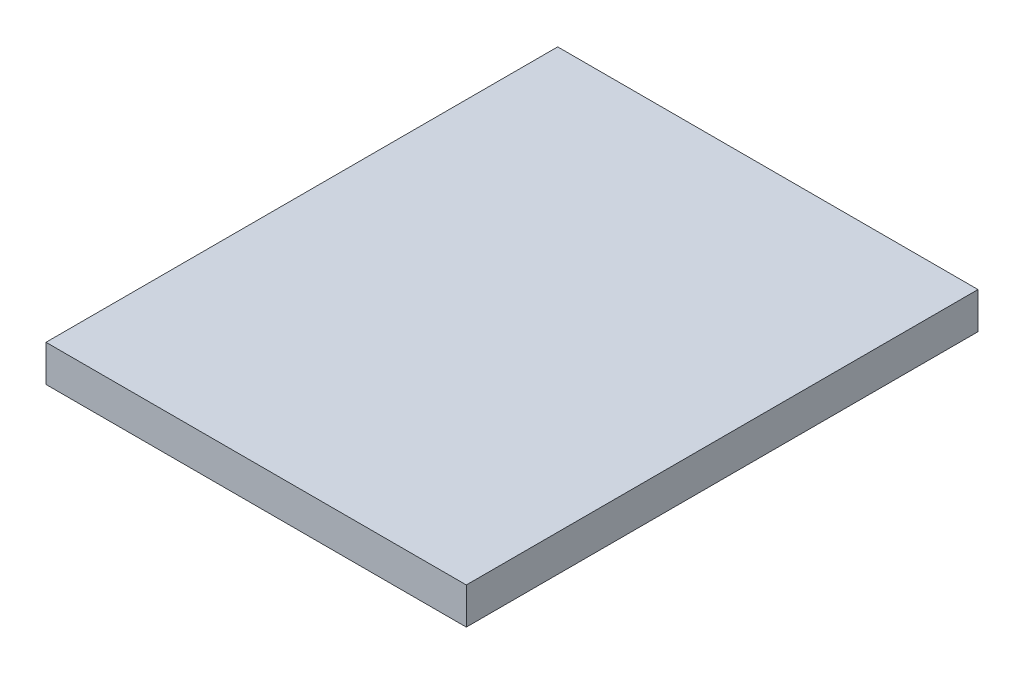
ISO-10303-21;
HEADER;
FILE_DESCRIPTION(('STEP AP214'),'2;1');
FILE_NAME('part.step','',(''),(''),'','','');
FILE_SCHEMA(('AUTOMOTIVE_DESIGN { 1 0 10303 214 1 1 1 1 }'));
ENDSEC;
DATA;
#1=APPLICATION_CONTEXT('core data for automotive mechanical design processes');
#2=APPLICATION_PROTOCOL_DEFINITION('international standard','automotive_design',2000,#1);
#3=PRODUCT_CONTEXT('',#1,'mechanical');
#4=PRODUCT('Part','Part','',(#3));
#5=PRODUCT_RELATED_PRODUCT_CATEGORY('part','',(#4));
#6=PRODUCT_DEFINITION_FORMATION('','',#4);
#7=PRODUCT_DEFINITION_CONTEXT('part definition',#1,'design');
#8=PRODUCT_DEFINITION('design','',#6,#7);
#9=PRODUCT_DEFINITION_SHAPE('','',#8);
#10=(LENGTH_UNIT() NAMED_UNIT(*) SI_UNIT(.MILLI.,.METRE.));
#11=(NAMED_UNIT(*) PLANE_ANGLE_UNIT() SI_UNIT($,.RADIAN.));
#12=(NAMED_UNIT(*) SI_UNIT($,.STERADIAN.) SOLID_ANGLE_UNIT());
#13=UNCERTAINTY_MEASURE_WITH_UNIT(LENGTH_MEASURE(1.E-05),#10,'distance_accuracy_value','');
#14=(GEOMETRIC_REPRESENTATION_CONTEXT(3) GLOBAL_UNCERTAINTY_ASSIGNED_CONTEXT((#13)) GLOBAL_UNIT_ASSIGNED_CONTEXT((#10,
#11,#12)) REPRESENTATION_CONTEXT('',''));
#15=CARTESIAN_POINT('',(0.,0.,0.));
#16=DIRECTION('',(0.,0.,1.));
#17=DIRECTION('',(1.,0.,0.));
#18=AXIS2_PLACEMENT_3D('',#15,#16,#17);
#19=CARTESIAN_POINT('',(0.,0.,0.));
#20=DIRECTION('',(0.,-1.,0.));
#21=DIRECTION('',(0.,0.,-1.));
#22=AXIS2_PLACEMENT_3D('',#19,#20,#21);
#23=PLANE('',#22);
#24=DIRECTION('',(0.,0.,1.));
#25=VECTOR('',#24,1.);
#26=CARTESIAN_POINT('',(0.,0.,0.));
#27=LINE('',#26,#25);
#28=CARTESIAN_POINT('',(0.,0.,-280.));
#29=VERTEX_POINT('',#28);
#30=CARTESIAN_POINT('',(0.,0.,0.));
#31=VERTEX_POINT('',#30);
#32=EDGE_CURVE('E142',#29,#31,#27,.T.);
#33=ORIENTED_EDGE('',*,*,#32,.F.);
#34=DIRECTION('',(-1.,0.,0.));
#35=VECTOR('',#34,1.);
#36=CARTESIAN_POINT('',(0.,0.,-280.));
#37=LINE('',#36,#35);
#38=CARTESIAN_POINT('',(230.,0.,-280.));
#39=VERTEX_POINT('',#38);
#40=EDGE_CURVE('E78',#39,#29,#37,.T.);
#41=ORIENTED_EDGE('',*,*,#40,.F.);
#42=DIRECTION('',(0.,0.,-1.));
#43=VECTOR('',#42,1.);
#44=CARTESIAN_POINT('',(230.,0.,0.));
#45=LINE('',#44,#43);
#46=CARTESIAN_POINT('',(230.,0.,0.));
#47=VERTEX_POINT('',#46);
#48=EDGE_CURVE('E157',#47,#39,#45,.T.);
#49=ORIENTED_EDGE('',*,*,#48,.F.);
#50=DIRECTION('',(1.,0.,0.));
#51=VECTOR('',#50,1.);
#52=CARTESIAN_POINT('',(0.,0.,0.));
#53=LINE('',#52,#51);
#54=EDGE_CURVE('E155',#31,#47,#53,.T.);
#55=ORIENTED_EDGE('',*,*,#54,.F.);
#56=EDGE_LOOP('',(#33,#41,#49,#55));
#57=FACE_BOUND('',#56,.T.);
#58=DIRECTION('',(1.,0.,0.));
#59=VECTOR('',#58,1.);
#60=CARTESIAN_POINT('',(214.705,0.,-16.5000000000001));
#61=LINE('',#60,#59);
#62=CARTESIAN_POINT('',(15.2949999999999,0.,-16.5));
#63=VERTEX_POINT('',#62);
#64=CARTESIAN_POINT('',(214.705,0.,-16.5000000000001));
#65=VERTEX_POINT('',#64);
#66=EDGE_CURVE('E129',#63,#65,#61,.T.);
#67=ORIENTED_EDGE('',*,*,#66,.T.);
#68=DIRECTION('',(0.,0.,-1.));
#69=VECTOR('',#68,1.);
#70=CARTESIAN_POINT('',(214.705,0.,-263.5));
#71=LINE('',#70,#69);
#72=CARTESIAN_POINT('',(214.705,0.,-263.5));
#73=VERTEX_POINT('',#72);
#74=EDGE_CURVE('E48',#65,#73,#71,.T.);
#75=ORIENTED_EDGE('',*,*,#74,.T.);
#76=DIRECTION('',(-1.,0.,0.));
#77=VECTOR('',#76,1.);
#78=CARTESIAN_POINT('',(214.705,0.,-263.5));
#79=LINE('',#78,#77);
#80=CARTESIAN_POINT('',(15.2949999999999,0.,-263.5));
#81=VERTEX_POINT('',#80);
#82=EDGE_CURVE('E112',#73,#81,#79,.T.);
#83=ORIENTED_EDGE('',*,*,#82,.T.);
#84=DIRECTION('',(0.,0.,1.));
#85=VECTOR('',#84,1.);
#86=CARTESIAN_POINT('',(15.2949999999999,0.,-263.5));
#87=LINE('',#86,#85);
#88=EDGE_CURVE('E132',#81,#63,#87,.T.);
#89=ORIENTED_EDGE('',*,*,#88,.T.);
#90=EDGE_LOOP('',(#67,#75,#83,#89));
#91=FACE_BOUND('',#90,.T.);
#92=ADVANCED_FACE('F33',(#57,#91),#23,.T.);
#93=CARTESIAN_POINT('',(0.,20.,0.));
#94=DIRECTION('',(1.,0.,0.));
#95=DIRECTION('',(0.,0.,-1.));
#96=AXIS2_PLACEMENT_3D('',#93,#94,#95);
#97=PLANE('',#96);
#98=ORIENTED_EDGE('',*,*,#32,.T.);
#99=DIRECTION('',(0.,-1.,0.));
#100=VECTOR('',#99,1.);
#101=CARTESIAN_POINT('',(0.,20.,0.));
#102=LINE('',#101,#100);
#103=CARTESIAN_POINT('',(0.,20.,0.));
#104=VERTEX_POINT('',#103);
#105=EDGE_CURVE('E11',#104,#31,#102,.T.);
#106=ORIENTED_EDGE('',*,*,#105,.F.);
#107=DIRECTION('',(0.,0.,1.));
#108=VECTOR('',#107,1.);
#109=CARTESIAN_POINT('',(0.,20.,0.));
#110=LINE('',#109,#108);
#111=CARTESIAN_POINT('',(0.,20.,-280.));
#112=VERTEX_POINT('',#111);
#113=EDGE_CURVE('E146',#112,#104,#110,.T.);
#114=ORIENTED_EDGE('',*,*,#113,.F.);
#115=DIRECTION('',(0.,-1.,0.));
#116=VECTOR('',#115,1.);
#117=CARTESIAN_POINT('',(0.,20.,-280.));
#118=LINE('',#117,#116);
#119=EDGE_CURVE('E152',#112,#29,#118,.T.);
#120=ORIENTED_EDGE('',*,*,#119,.T.);
#121=EDGE_LOOP('',(#98,#106,#114,#120));
#122=FACE_BOUND('',#121,.T.);
#123=ADVANCED_FACE('F35',(#122),#97,.F.);
#124=CARTESIAN_POINT('',(0.,20.,0.));
#125=DIRECTION('',(0.,0.,-1.));
#126=DIRECTION('',(-1.,0.,0.));
#127=AXIS2_PLACEMENT_3D('',#124,#125,#126);
#128=PLANE('',#127);
#129=ORIENTED_EDGE('',*,*,#54,.T.);
#130=DIRECTION('',(0.,-1.,0.));
#131=VECTOR('',#130,1.);
#132=CARTESIAN_POINT('',(230.,20.,0.));
#133=LINE('',#132,#131);
#134=CARTESIAN_POINT('',(230.,20.,0.));
#135=VERTEX_POINT('',#134);
#136=EDGE_CURVE('E41',#135,#47,#133,.T.);
#137=ORIENTED_EDGE('',*,*,#136,.F.);
#138=DIRECTION('',(1.,0.,0.));
#139=VECTOR('',#138,1.);
#140=CARTESIAN_POINT('',(0.,20.,0.));
#141=LINE('',#140,#139);
#142=EDGE_CURVE('E85',#104,#135,#141,.T.);
#143=ORIENTED_EDGE('',*,*,#142,.F.);
#144=ORIENTED_EDGE('',*,*,#105,.T.);
#145=EDGE_LOOP('',(#129,#137,#143,#144));
#146=FACE_BOUND('',#145,.T.);
#147=ADVANCED_FACE('F183',(#146),#128,.F.);
#148=CARTESIAN_POINT('',(230.,20.,0.));
#149=DIRECTION('',(-1.,0.,0.));
#150=DIRECTION('',(0.,0.,1.));
#151=AXIS2_PLACEMENT_3D('',#148,#149,#150);
#152=PLANE('',#151);
#153=ORIENTED_EDGE('',*,*,#48,.T.);
#154=DIRECTION('',(0.,-1.,0.));
#155=VECTOR('',#154,1.);
#156=CARTESIAN_POINT('',(230.,20.,-280.));
#157=LINE('',#156,#155);
#158=CARTESIAN_POINT('',(230.,20.,-280.));
#159=VERTEX_POINT('',#158);
#160=EDGE_CURVE('E161',#159,#39,#157,.T.);
#161=ORIENTED_EDGE('',*,*,#160,.F.);
#162=DIRECTION('',(0.,0.,-1.));
#163=VECTOR('',#162,1.);
#164=CARTESIAN_POINT('',(230.,20.,0.));
#165=LINE('',#164,#163);
#166=EDGE_CURVE('E149',#135,#159,#165,.T.);
#167=ORIENTED_EDGE('',*,*,#166,.F.);
#168=ORIENTED_EDGE('',*,*,#136,.T.);
#169=EDGE_LOOP('',(#153,#161,#167,#168));
#170=FACE_BOUND('',#169,.T.);
#171=ADVANCED_FACE('F166',(#170),#152,.F.);
#172=CARTESIAN_POINT('',(0.,20.,-280.));
#173=DIRECTION('',(0.,0.,1.));
#174=DIRECTION('',(1.,0.,0.));
#175=AXIS2_PLACEMENT_3D('',#172,#173,#174);
#176=PLANE('',#175);
#177=ORIENTED_EDGE('',*,*,#40,.T.);
#178=ORIENTED_EDGE('',*,*,#119,.F.);
#179=DIRECTION('',(-1.,0.,0.));
#180=VECTOR('',#179,1.);
#181=CARTESIAN_POINT('',(0.,20.,-280.));
#182=LINE('',#181,#180);
#183=EDGE_CURVE('E57',#159,#112,#182,.T.);
#184=ORIENTED_EDGE('',*,*,#183,.F.);
#185=ORIENTED_EDGE('',*,*,#160,.T.);
#186=EDGE_LOOP('',(#177,#178,#184,#185));
#187=FACE_BOUND('',#186,.T.);
#188=ADVANCED_FACE('F174',(#187),#176,.F.);
#189=CARTESIAN_POINT('',(0.,20.,0.));
#190=DIRECTION('',(0.,-1.,0.));
#191=DIRECTION('',(0.,0.,-1.));
#192=AXIS2_PLACEMENT_3D('',#189,#190,#191);
#193=PLANE('',#192);
#194=ORIENTED_EDGE('',*,*,#113,.T.);
#195=ORIENTED_EDGE('',*,*,#142,.T.);
#196=ORIENTED_EDGE('',*,*,#166,.T.);
#197=ORIENTED_EDGE('',*,*,#183,.T.);
#198=EDGE_LOOP('',(#194,#195,#196,#197));
#199=FACE_BOUND('',#198,.T.);
#200=ADVANCED_FACE('F176',(#199),#193,.F.);
#201=CARTESIAN_POINT('',(214.705,-10.,-263.5));
#202=DIRECTION('',(1.,0.,0.));
#203=DIRECTION('',(0.,0.,-1.));
#204=AXIS2_PLACEMENT_3D('',#201,#202,#203);
#205=PLANE('',#204);
#206=ORIENTED_EDGE('',*,*,#74,.F.);
#207=DIRECTION('',(0.,1.,0.));
#208=VECTOR('',#207,1.);
#209=CARTESIAN_POINT('',(214.705,-10.,-16.5000000000001));
#210=LINE('',#209,#208);
#211=CARTESIAN_POINT('',(214.705,-10.,-16.5000000000001));
#212=VERTEX_POINT('',#211);
#213=EDGE_CURVE('E128',#212,#65,#210,.T.);
#214=ORIENTED_EDGE('',*,*,#213,.F.);
#215=DIRECTION('',(0.,0.,-1.));
#216=VECTOR('',#215,1.);
#217=CARTESIAN_POINT('',(214.705,-10.,-263.5));
#218=LINE('',#217,#216);
#219=CARTESIAN_POINT('',(214.705,-10.,-263.5));
#220=VERTEX_POINT('',#219);
#221=EDGE_CURVE('E122',#212,#220,#218,.T.);
#222=ORIENTED_EDGE('',*,*,#221,.T.);
#223=DIRECTION('',(0.,1.,0.));
#224=VECTOR('',#223,1.);
#225=CARTESIAN_POINT('',(214.705,-10.,-263.5));
#226=LINE('',#225,#224);
#227=EDGE_CURVE('E107',#220,#73,#226,.T.);
#228=ORIENTED_EDGE('',*,*,#227,.T.);
#229=EDGE_LOOP('',(#206,#214,#222,#228));
#230=FACE_BOUND('',#229,.T.);
#231=ADVANCED_FACE('F127',(#230),#205,.T.);
#232=CARTESIAN_POINT('',(214.705,-10.,-16.5000000000001));
#233=DIRECTION('',(0.,0.,1.));
#234=DIRECTION('',(1.,0.,0.));
#235=AXIS2_PLACEMENT_3D('',#232,#233,#234);
#236=PLANE('',#235);
#237=ORIENTED_EDGE('',*,*,#66,.F.);
#238=DIRECTION('',(0.,1.,0.));
#239=VECTOR('',#238,1.);
#240=CARTESIAN_POINT('',(15.2949999999999,-10.,-16.5));
#241=LINE('',#240,#239);
#242=CARTESIAN_POINT('',(15.2949999999999,-10.,-16.5));
#243=VERTEX_POINT('',#242);
#244=EDGE_CURVE('E143',#243,#63,#241,.T.);
#245=ORIENTED_EDGE('',*,*,#244,.F.);
#246=DIRECTION('',(1.,0.,0.));
#247=VECTOR('',#246,1.);
#248=CARTESIAN_POINT('',(214.705,-10.,-16.5000000000001));
#249=LINE('',#248,#247);
#250=EDGE_CURVE('E115',#243,#212,#249,.T.);
#251=ORIENTED_EDGE('',*,*,#250,.T.);
#252=ORIENTED_EDGE('',*,*,#213,.T.);
#253=EDGE_LOOP('',(#237,#245,#251,#252));
#254=FACE_BOUND('',#253,.T.);
#255=ADVANCED_FACE('F193',(#254),#236,.T.);
#256=CARTESIAN_POINT('',(15.2949999999999,-10.,-263.5));
#257=DIRECTION('',(-1.,0.,0.));
#258=DIRECTION('',(0.,0.,1.));
#259=AXIS2_PLACEMENT_3D('',#256,#257,#258);
#260=PLANE('',#259);
#261=ORIENTED_EDGE('',*,*,#88,.F.);
#262=DIRECTION('',(0.,1.,0.));
#263=VECTOR('',#262,1.);
#264=CARTESIAN_POINT('',(15.2949999999999,-10.,-263.5));
#265=LINE('',#264,#263);
#266=CARTESIAN_POINT('',(15.2949999999999,-10.,-263.5));
#267=VERTEX_POINT('',#266);
#268=EDGE_CURVE('E114',#267,#81,#265,.T.);
#269=ORIENTED_EDGE('',*,*,#268,.F.);
#270=DIRECTION('',(0.,0.,1.));
#271=VECTOR('',#270,1.);
#272=CARTESIAN_POINT('',(15.2949999999999,-10.,-263.5));
#273=LINE('',#272,#271);
#274=EDGE_CURVE('E125',#267,#243,#273,.T.);
#275=ORIENTED_EDGE('',*,*,#274,.T.);
#276=ORIENTED_EDGE('',*,*,#244,.T.);
#277=EDGE_LOOP('',(#261,#269,#275,#276));
#278=FACE_BOUND('',#277,.T.);
#279=ADVANCED_FACE('F196',(#278),#260,.T.);
#280=CARTESIAN_POINT('',(214.705,-10.,-263.5));
#281=DIRECTION('',(0.,0.,-1.));
#282=DIRECTION('',(-1.,0.,0.));
#283=AXIS2_PLACEMENT_3D('',#280,#281,#282);
#284=PLANE('',#283);
#285=ORIENTED_EDGE('',*,*,#82,.F.);
#286=ORIENTED_EDGE('',*,*,#227,.F.);
#287=DIRECTION('',(-1.,0.,0.));
#288=VECTOR('',#287,1.);
#289=CARTESIAN_POINT('',(214.705,-10.,-263.5));
#290=LINE('',#289,#288);
#291=EDGE_CURVE('E110',#220,#267,#290,.T.);
#292=ORIENTED_EDGE('',*,*,#291,.T.);
#293=ORIENTED_EDGE('',*,*,#268,.T.);
#294=EDGE_LOOP('',(#285,#286,#292,#293));
#295=FACE_BOUND('',#294,.T.);
#296=ADVANCED_FACE('F109',(#295),#284,.T.);
#297=CARTESIAN_POINT('',(0.,-10.,0.));
#298=DIRECTION('',(0.,-1.,0.));
#299=DIRECTION('',(0.,0.,-1.));
#300=AXIS2_PLACEMENT_3D('',#297,#298,#299);
#301=PLANE('',#300);
#302=ORIENTED_EDGE('',*,*,#221,.F.);
#303=ORIENTED_EDGE('',*,*,#250,.F.);
#304=ORIENTED_EDGE('',*,*,#274,.F.);
#305=ORIENTED_EDGE('',*,*,#291,.F.);
#306=EDGE_LOOP('',(#302,#303,#304,#305));
#307=FACE_BOUND('',#306,.T.);
#308=ADVANCED_FACE('F120',(#307),#301,.T.);
#309=CLOSED_SHELL('',(#92,#123,#147,#171,#188,#200,#231,#255,#279,#296,#308));
#310=MANIFOLD_SOLID_BREP('B2',#309);
#311=ADVANCED_BREP_SHAPE_REPRESENTATION('',(#18,#310),#14);
#312=SHAPE_DEFINITION_REPRESENTATION(#9,#311);
ENDSEC;
END-ISO-10303-21;
